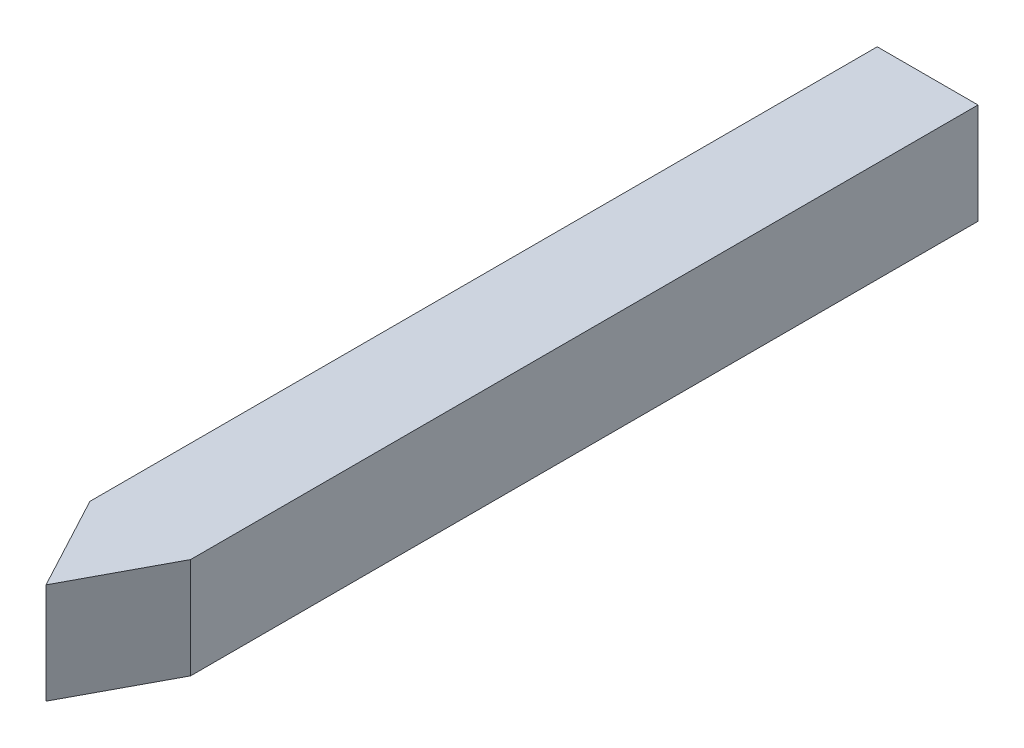
ISO-10303-21;
HEADER;
FILE_DESCRIPTION(('STEP AP214'),'2;1');
FILE_NAME('part.step','',(''),(''),'','','');
FILE_SCHEMA(('AUTOMOTIVE_DESIGN { 1 0 10303 214 1 1 1 1 }'));
ENDSEC;
DATA;
#1=APPLICATION_CONTEXT('core data for automotive mechanical design processes');
#2=APPLICATION_PROTOCOL_DEFINITION('international standard','automotive_design',2000,#1);
#3=PRODUCT_CONTEXT('',#1,'mechanical');
#4=PRODUCT('Part','Part','',(#3));
#5=PRODUCT_RELATED_PRODUCT_CATEGORY('part','',(#4));
#6=PRODUCT_DEFINITION_FORMATION('','',#4);
#7=PRODUCT_DEFINITION_CONTEXT('part definition',#1,'design');
#8=PRODUCT_DEFINITION('design','',#6,#7);
#9=PRODUCT_DEFINITION_SHAPE('','',#8);
#10=(LENGTH_UNIT() NAMED_UNIT(*) SI_UNIT(.MILLI.,.METRE.));
#11=(NAMED_UNIT(*) PLANE_ANGLE_UNIT() SI_UNIT($,.RADIAN.));
#12=(NAMED_UNIT(*) SI_UNIT($,.STERADIAN.) SOLID_ANGLE_UNIT());
#13=UNCERTAINTY_MEASURE_WITH_UNIT(LENGTH_MEASURE(1.E-05),#10,'distance_accuracy_value','');
#14=(GEOMETRIC_REPRESENTATION_CONTEXT(3) GLOBAL_UNCERTAINTY_ASSIGNED_CONTEXT((#13)) GLOBAL_UNIT_ASSIGNED_CONTEXT((#10,
#11,#12)) REPRESENTATION_CONTEXT('',''));
#15=CARTESIAN_POINT('',(0.,0.,0.));
#16=DIRECTION('',(0.,0.,1.));
#17=DIRECTION('',(1.,0.,0.));
#18=AXIS2_PLACEMENT_3D('',#15,#16,#17);
#19=CARTESIAN_POINT('',(6.,-6.,105.));
#20=DIRECTION('',(-1.,0.,0.));
#21=DIRECTION('',(0.,0.,1.));
#22=AXIS2_PLACEMENT_3D('',#19,#20,#21);
#23=PLANE('',#22);
#24=DIRECTION('',(0.,1.,0.));
#25=VECTOR('',#24,1.);
#26=CARTESIAN_POINT('',(6.,-114.,93.774608016588));
#27=LINE('',#26,#25);
#28=CARTESIAN_POINT('',(6.,-6.00000000000001,93.774608016588));
#29=VERTEX_POINT('',#28);
#30=CARTESIAN_POINT('',(6.,6.,93.774608016588));
#31=VERTEX_POINT('',#30);
#32=EDGE_CURVE('E104',#29,#31,#27,.T.);
#33=ORIENTED_EDGE('',*,*,#32,.F.);
#34=DIRECTION('',(0.,0.,-1.));
#35=VECTOR('',#34,1.);
#36=CARTESIAN_POINT('',(6.,-6.,105.));
#37=LINE('',#36,#35);
#38=CARTESIAN_POINT('',(6.,-6.,0.));
#39=VERTEX_POINT('',#38);
#40=EDGE_CURVE('E72',#29,#39,#37,.T.);
#41=ORIENTED_EDGE('',*,*,#40,.T.);
#42=DIRECTION('',(0.,1.,0.));
#43=VECTOR('',#42,1.);
#44=CARTESIAN_POINT('',(6.,-6.,0.));
#45=LINE('',#44,#43);
#46=CARTESIAN_POINT('',(6.,6.,0.));
#47=VERTEX_POINT('',#46);
#48=EDGE_CURVE('E122',#39,#47,#45,.T.);
#49=ORIENTED_EDGE('',*,*,#48,.T.);
#50=DIRECTION('',(0.,0.,-1.));
#51=VECTOR('',#50,1.);
#52=CARTESIAN_POINT('',(6.,6.,105.));
#53=LINE('',#52,#51);
#54=EDGE_CURVE('E65',#31,#47,#53,.T.);
#55=ORIENTED_EDGE('',*,*,#54,.F.);
#56=EDGE_LOOP('',(#33,#41,#49,#55));
#57=FACE_BOUND('',#56,.T.);
#58=ADVANCED_FACE('F58',(#57),#23,.F.);
#59=CARTESIAN_POINT('',(-6.,6.,105.));
#60=DIRECTION('',(0.,-1.,0.));
#61=DIRECTION('',(0.,0.,-1.));
#62=AXIS2_PLACEMENT_3D('',#59,#60,#61);
#63=PLANE('',#62);
#64=DIRECTION('',(0.471390808200951,0.,-0.881924433238843));
#65=VECTOR('',#64,1.);
#66=CARTESIAN_POINT('',(43.6517624924455,6.,23.3319758759163));
#67=LINE('',#66,#65);
#68=CARTESIAN_POINT('',(0.,6.,105.));
#69=VERTEX_POINT('',#68);
#70=EDGE_CURVE('E107',#69,#31,#67,.T.);
#71=ORIENTED_EDGE('',*,*,#70,.T.);
#72=ORIENTED_EDGE('',*,*,#54,.T.);
#73=DIRECTION('',(-1.,0.,0.));
#74=VECTOR('',#73,1.);
#75=CARTESIAN_POINT('',(-6.,6.,0.));
#76=LINE('',#75,#74);
#77=CARTESIAN_POINT('',(-6.,6.,0.));
#78=VERTEX_POINT('',#77);
#79=EDGE_CURVE('E132',#47,#78,#76,.T.);
#80=ORIENTED_EDGE('',*,*,#79,.T.);
#81=DIRECTION('',(0.,0.,-1.));
#82=VECTOR('',#81,1.);
#83=CARTESIAN_POINT('',(-6.,6.,105.));
#84=LINE('',#83,#82);
#85=CARTESIAN_POINT('',(-6.,6.,93.774608016588));
#86=VERTEX_POINT('',#85);
#87=EDGE_CURVE('E123',#86,#78,#84,.T.);
#88=ORIENTED_EDGE('',*,*,#87,.F.);
#89=DIRECTION('',(-0.471390808200951,0.,-0.881924433238843));
#90=VECTOR('',#89,1.);
#91=CARTESIAN_POINT('',(-43.6517624924455,6.,23.3319758759163));
#92=LINE('',#91,#90);
#93=EDGE_CURVE('E119',#69,#86,#92,.T.);
#94=ORIENTED_EDGE('',*,*,#93,.F.);
#95=EDGE_LOOP('',(#71,#72,#80,#88,#94));
#96=FACE_BOUND('',#95,.T.);
#97=ADVANCED_FACE('F115',(#96),#63,.F.);
#98=CARTESIAN_POINT('',(-6.,-6.,105.));
#99=DIRECTION('',(0.,1.,0.));
#100=DIRECTION('',(0.,0.,1.));
#101=AXIS2_PLACEMENT_3D('',#98,#99,#100);
#102=PLANE('',#101);
#103=DIRECTION('',(0.471390808200951,0.,-0.881924433238843));
#104=VECTOR('',#103,1.);
#105=CARTESIAN_POINT('',(-1.33325576433807,-6.,107.49438642814));
#106=LINE('',#105,#104);
#107=CARTESIAN_POINT('',(0.,-6.00000000000001,105.));
#108=VERTEX_POINT('',#107);
#109=EDGE_CURVE('E110',#108,#29,#106,.T.);
#110=ORIENTED_EDGE('',*,*,#109,.F.);
#111=DIRECTION('',(-0.471390808200951,0.,-0.881924433238843));
#112=VECTOR('',#111,1.);
#113=CARTESIAN_POINT('',(-1.33325576433809,-6.,102.50561357186));
#114=LINE('',#113,#112);
#115=CARTESIAN_POINT('',(-6.,-6.00000000000001,93.774608016588));
#116=VERTEX_POINT('',#115);
#117=EDGE_CURVE('E135',#108,#116,#114,.T.);
#118=ORIENTED_EDGE('',*,*,#117,.T.);
#119=DIRECTION('',(0.,0.,-1.));
#120=VECTOR('',#119,1.);
#121=CARTESIAN_POINT('',(-6.,-6.,105.));
#122=LINE('',#121,#120);
#123=CARTESIAN_POINT('',(-6.,-6.,0.));
#124=VERTEX_POINT('',#123);
#125=EDGE_CURVE('E79',#116,#124,#122,.T.);
#126=ORIENTED_EDGE('',*,*,#125,.T.);
#127=DIRECTION('',(1.,0.,0.));
#128=VECTOR('',#127,1.);
#129=CARTESIAN_POINT('',(-6.,-6.,0.));
#130=LINE('',#129,#128);
#131=EDGE_CURVE('E128',#124,#39,#130,.T.);
#132=ORIENTED_EDGE('',*,*,#131,.T.);
#133=ORIENTED_EDGE('',*,*,#40,.F.);
#134=EDGE_LOOP('',(#110,#118,#126,#132,#133));
#135=FACE_BOUND('',#134,.T.);
#136=ADVANCED_FACE('F150',(#135),#102,.F.);
#137=CARTESIAN_POINT('',(-6.,-6.,105.));
#138=DIRECTION('',(1.,0.,0.));
#139=DIRECTION('',(0.,0.,-1.));
#140=AXIS2_PLACEMENT_3D('',#137,#138,#139);
#141=PLANE('',#140);
#142=ORIENTED_EDGE('',*,*,#125,.F.);
#143=DIRECTION('',(0.,1.,0.));
#144=VECTOR('',#143,1.);
#145=CARTESIAN_POINT('',(-6.,-114.,93.774608016588));
#146=LINE('',#145,#144);
#147=EDGE_CURVE('E137',#116,#86,#146,.T.);
#148=ORIENTED_EDGE('',*,*,#147,.T.);
#149=ORIENTED_EDGE('',*,*,#87,.T.);
#150=DIRECTION('',(0.,-1.,0.));
#151=VECTOR('',#150,1.);
#152=CARTESIAN_POINT('',(-6.,-6.,0.));
#153=LINE('',#152,#151);
#154=EDGE_CURVE('E130',#78,#124,#153,.T.);
#155=ORIENTED_EDGE('',*,*,#154,.T.);
#156=EDGE_LOOP('',(#142,#148,#149,#155));
#157=FACE_BOUND('',#156,.T.);
#158=ADVANCED_FACE('F145',(#157),#141,.F.);
#159=CARTESIAN_POINT('',(0.,0.,0.));
#160=DIRECTION('',(0.,0.,-1.));
#161=DIRECTION('',(-1.,0.,0.));
#162=AXIS2_PLACEMENT_3D('',#159,#160,#161);
#163=PLANE('',#162);
#164=ORIENTED_EDGE('',*,*,#48,.F.);
#165=ORIENTED_EDGE('',*,*,#131,.F.);
#166=ORIENTED_EDGE('',*,*,#154,.F.);
#167=ORIENTED_EDGE('',*,*,#79,.F.);
#168=EDGE_LOOP('',(#164,#165,#166,#167));
#169=FACE_BOUND('',#168,.T.);
#170=ADVANCED_FACE('F149',(#169),#163,.T.);
#171=CARTESIAN_POINT('',(-43.6517624924455,-114.,23.3319758759163));
#172=DIRECTION('',(0.881924433238843,0.,-0.471390808200951));
#173=DIRECTION('',(-0.471390808200951,0.,-0.881924433238843));
#174=AXIS2_PLACEMENT_3D('',#171,#172,#173);
#175=PLANE('',#174);
#176=DIRECTION('',(0.,-1.,0.));
#177=VECTOR('',#176,1.);
#178=CARTESIAN_POINT('',(0.,0.,105.));
#179=LINE('',#178,#177);
#180=EDGE_CURVE('E12',#69,#108,#179,.T.);
#181=ORIENTED_EDGE('',*,*,#180,.F.);
#182=ORIENTED_EDGE('',*,*,#93,.T.);
#183=ORIENTED_EDGE('',*,*,#147,.F.);
#184=ORIENTED_EDGE('',*,*,#117,.F.);
#185=EDGE_LOOP('',(#181,#182,#183,#184));
#186=FACE_BOUND('',#185,.T.);
#187=ADVANCED_FACE('F142',(#186),#175,.F.);
#188=CARTESIAN_POINT('',(43.6517624924455,-114.,23.3319758759163));
#189=DIRECTION('',(0.881924433238843,0.,0.471390808200951));
#190=DIRECTION('',(0.471390808200951,0.,-0.881924433238843));
#191=AXIS2_PLACEMENT_3D('',#188,#189,#190);
#192=PLANE('',#191);
#193=ORIENTED_EDGE('',*,*,#109,.T.);
#194=ORIENTED_EDGE('',*,*,#32,.T.);
#195=ORIENTED_EDGE('',*,*,#70,.F.);
#196=ORIENTED_EDGE('',*,*,#180,.T.);
#197=EDGE_LOOP('',(#193,#194,#195,#196));
#198=FACE_BOUND('',#197,.T.);
#199=ADVANCED_FACE('F106',(#198),#192,.T.);
#200=CLOSED_SHELL('',(#58,#97,#136,#158,#170,#187,#199));
#201=MANIFOLD_SOLID_BREP('B2',#200);
#202=ADVANCED_BREP_SHAPE_REPRESENTATION('',(#18,#201),#14);
#203=SHAPE_DEFINITION_REPRESENTATION(#9,#202);
ENDSEC;
END-ISO-10303-21;
